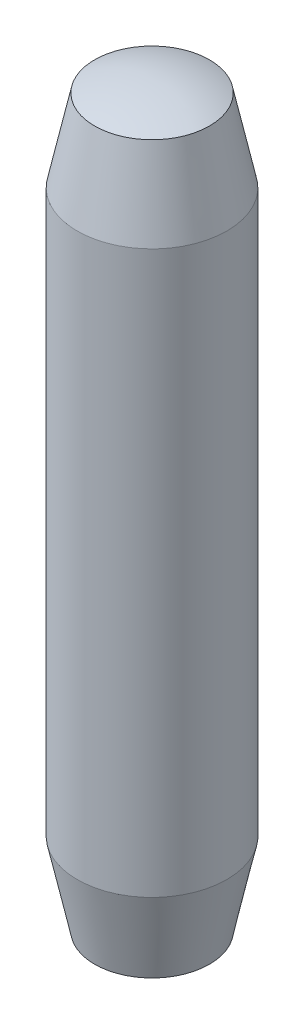
ISO-10303-21;
HEADER;
FILE_DESCRIPTION(('STEP AP214'),'2;1');
FILE_NAME('part.step','',(''),(''),'','','');
FILE_SCHEMA(('AUTOMOTIVE_DESIGN { 1 0 10303 214 1 1 1 1 }'));
ENDSEC;
DATA;
#1=APPLICATION_CONTEXT('core data for automotive mechanical design processes');
#2=APPLICATION_PROTOCOL_DEFINITION('international standard','automotive_design',2000,#1);
#3=PRODUCT_CONTEXT('',#1,'mechanical');
#4=PRODUCT('Part','Part','',(#3));
#5=PRODUCT_RELATED_PRODUCT_CATEGORY('part','',(#4));
#6=PRODUCT_DEFINITION_FORMATION('','',#4);
#7=PRODUCT_DEFINITION_CONTEXT('part definition',#1,'design');
#8=PRODUCT_DEFINITION('design','',#6,#7);
#9=PRODUCT_DEFINITION_SHAPE('','',#8);
#10=(LENGTH_UNIT() NAMED_UNIT(*) SI_UNIT(.MILLI.,.METRE.));
#11=(NAMED_UNIT(*) PLANE_ANGLE_UNIT() SI_UNIT($,.RADIAN.));
#12=(NAMED_UNIT(*) SI_UNIT($,.STERADIAN.) SOLID_ANGLE_UNIT());
#13=UNCERTAINTY_MEASURE_WITH_UNIT(LENGTH_MEASURE(1.E-05),#10,'distance_accuracy_value','');
#14=(GEOMETRIC_REPRESENTATION_CONTEXT(3) GLOBAL_UNCERTAINTY_ASSIGNED_CONTEXT((#13)) GLOBAL_UNIT_ASSIGNED_CONTEXT((#10,
#11,#12)) REPRESENTATION_CONTEXT('',''));
#15=CARTESIAN_POINT('',(0.,0.,0.));
#16=DIRECTION('',(0.,0.,1.));
#17=DIRECTION('',(1.,0.,0.));
#18=AXIS2_PLACEMENT_3D('',#15,#16,#17);
#19=CARTESIAN_POINT('',(0.,4.,0.));
#20=DIRECTION('',(0.,-1.,0.));
#21=DIRECTION('',(0.,0.,-1.));
#22=AXIS2_PLACEMENT_3D('',#19,#20,#21);
#23=CYLINDRICAL_SURFACE('',#22,0.4);
#24=CARTESIAN_POINT('',(0.,3.5,0.));
#25=DIRECTION('',(0.,-1.,0.));
#26=DIRECTION('',(1.,0.,0.));
#27=AXIS2_PLACEMENT_3D('',#24,#25,#26);
#28=CIRCLE('',#27,0.4);
#29=CARTESIAN_POINT('',(0.4,3.5,0.));
#30=VERTEX_POINT('',#29);
#31=EDGE_CURVE('E11',#30,#30,#28,.T.);
#32=ORIENTED_EDGE('',*,*,#31,.T.);
#33=EDGE_LOOP('',(#32));
#34=FACE_BOUND('',#33,.T.);
#35=CARTESIAN_POINT('',(0.,0.5,0.));
#36=DIRECTION('',(0.,-1.,0.));
#37=DIRECTION('',(1.,0.,0.));
#38=AXIS2_PLACEMENT_3D('',#35,#36,#37);
#39=CIRCLE('',#38,0.4);
#40=CARTESIAN_POINT('',(0.4,0.5,0.));
#41=VERTEX_POINT('',#40);
#42=EDGE_CURVE('E55',#41,#41,#39,.T.);
#43=ORIENTED_EDGE('',*,*,#42,.F.);
#44=EDGE_LOOP('',(#43));
#45=FACE_BOUND('',#44,.T.);
#46=ADVANCED_FACE('F33',(#34,#45),#23,.T.);
#47=CARTESIAN_POINT('',(0.,3.5,0.));
#48=DIRECTION('',(0.,-1.,0.));
#49=DIRECTION('',(1.,0.,0.));
#50=AXIS2_PLACEMENT_3D('',#47,#48,#49);
#51=CONICAL_SURFACE('',#50,0.4,0.209439510239313);
#52=CARTESIAN_POINT('',(0.,3.9388676596663,0.));
#53=DIRECTION('',(0.,-1.,0.));
#54=DIRECTION('',(1.,0.,0.));
#55=AXIS2_PLACEMENT_3D('',#52,#53,#54);
#56=CIRCLE('',#55,0.306715799233164);
#57=CARTESIAN_POINT('',(0.306715799233164,3.9388676596663,0.));
#58=VERTEX_POINT('',#57);
#59=EDGE_CURVE('E40',#58,#58,#56,.T.);
#60=ORIENTED_EDGE('',*,*,#59,.T.);
#61=EDGE_LOOP('',(#60));
#62=FACE_BOUND('',#61,.T.);
#63=ORIENTED_EDGE('',*,*,#31,.F.);
#64=EDGE_LOOP('',(#63));
#65=FACE_BOUND('',#64,.T.);
#66=ADVANCED_FACE('F50',(#62,#65),#51,.T.);
#67=CARTESIAN_POINT('',(0.,3.2,0.));
#68=DIRECTION('',(0.,-1.,0.));
#69=DIRECTION('',(1.,0.,0.));
#70=AXIS2_PLACEMENT_3D('',#67,#68,#69);
#71=SPHERICAL_SURFACE('',#70,0.8);
#72=CARTESIAN_POINT('',(0.,4.,0.));
#73=VERTEX_POINT('',#72);
#74=VERTEX_LOOP('',#73);
#75=FACE_BOUND('',#74,.T.);
#76=ORIENTED_EDGE('',*,*,#59,.F.);
#77=EDGE_LOOP('',(#76));
#78=FACE_BOUND('',#77,.T.);
#79=ADVANCED_FACE('F46',(#75,#78),#71,.T.);
#80=CARTESIAN_POINT('',(0.,0.0611323403336963,0.));
#81=DIRECTION('',(0.,1.,0.));
#82=DIRECTION('',(-1.,0.,0.));
#83=AXIS2_PLACEMENT_3D('',#80,#81,#82);
#84=CONICAL_SURFACE('',#83,0.306715799233164,0.209439510239313);
#85=ORIENTED_EDGE('',*,*,#42,.T.);
#86=EDGE_LOOP('',(#85));
#87=FACE_BOUND('',#86,.T.);
#88=CARTESIAN_POINT('',(0.,0.0611323403336963,0.));
#89=DIRECTION('',(0.,-1.,0.));
#90=DIRECTION('',(1.,0.,0.));
#91=AXIS2_PLACEMENT_3D('',#88,#89,#90);
#92=CIRCLE('',#91,0.306715799233164);
#93=CARTESIAN_POINT('',(0.306715799233164,0.0611323403336963,0.));
#94=VERTEX_POINT('',#93);
#95=EDGE_CURVE('E57',#94,#94,#92,.T.);
#96=ORIENTED_EDGE('',*,*,#95,.F.);
#97=EDGE_LOOP('',(#96));
#98=FACE_BOUND('',#97,.T.);
#99=ADVANCED_FACE('F49',(#87,#98),#84,.T.);
#100=CARTESIAN_POINT('',(0.,0.8,0.));
#101=DIRECTION('',(0.,-1.,0.));
#102=DIRECTION('',(1.,0.,0.));
#103=AXIS2_PLACEMENT_3D('',#100,#101,#102);
#104=SPHERICAL_SURFACE('',#103,0.8);
#105=CARTESIAN_POINT('',(0.,0.,0.));
#106=VERTEX_POINT('',#105);
#107=VERTEX_LOOP('',#106);
#108=FACE_BOUND('',#107,.T.);
#109=ORIENTED_EDGE('',*,*,#95,.T.);
#110=EDGE_LOOP('',(#109));
#111=FACE_BOUND('',#110,.T.);
#112=ADVANCED_FACE('F63',(#108,#111),#104,.T.);
#113=CLOSED_SHELL('',(#46,#66,#79,#99,#112));
#114=MANIFOLD_SOLID_BREP('B2',#113);
#115=ADVANCED_BREP_SHAPE_REPRESENTATION('',(#18,#114),#14);
#116=SHAPE_DEFINITION_REPRESENTATION(#9,#115);
ENDSEC;
END-ISO-10303-21;
